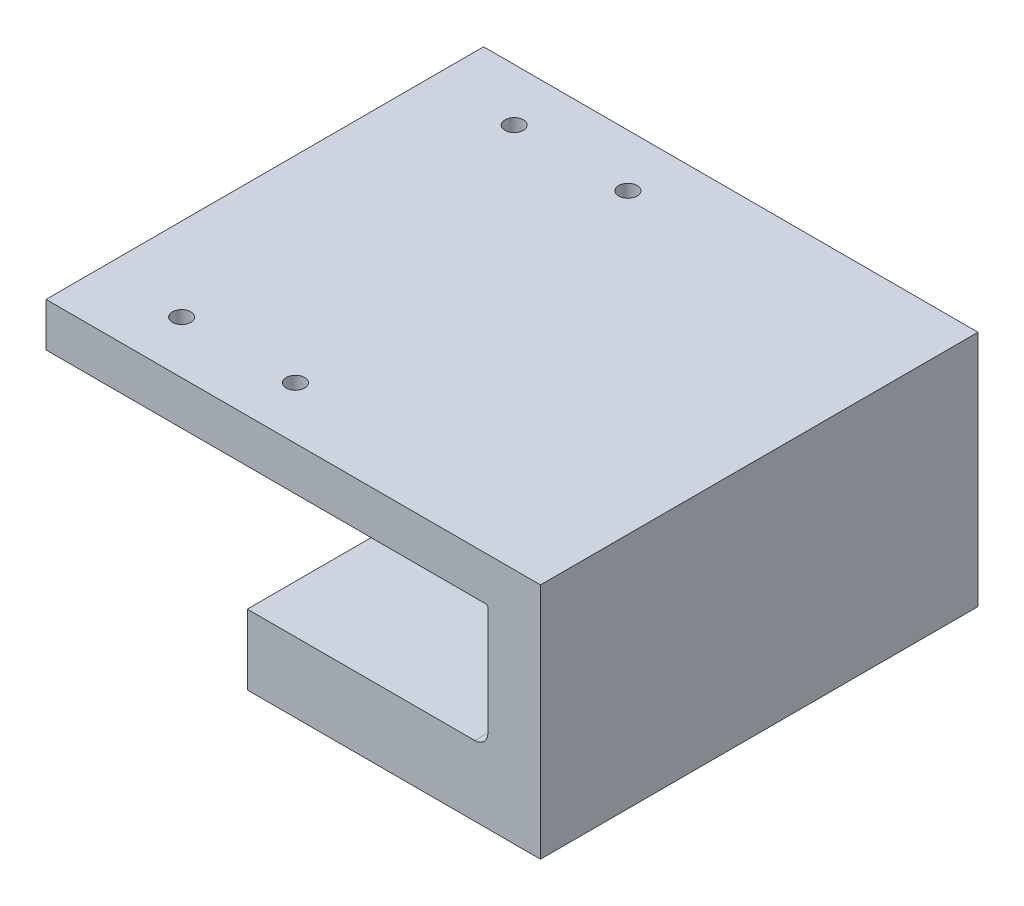
ISO-10303-21;
HEADER;
FILE_DESCRIPTION(('STEP AP214'),'2;1');
FILE_NAME('part.step','',(''),(''),'','','');
FILE_SCHEMA(('AUTOMOTIVE_DESIGN { 1 0 10303 214 1 1 1 1 }'));
ENDSEC;
DATA;
#1=APPLICATION_CONTEXT('core data for automotive mechanical design processes');
#2=APPLICATION_PROTOCOL_DEFINITION('international standard','automotive_design',2000,#1);
#3=PRODUCT_CONTEXT('',#1,'mechanical');
#4=PRODUCT('Part','Part','',(#3));
#5=PRODUCT_RELATED_PRODUCT_CATEGORY('part','',(#4));
#6=PRODUCT_DEFINITION_FORMATION('','',#4);
#7=PRODUCT_DEFINITION_CONTEXT('part definition',#1,'design');
#8=PRODUCT_DEFINITION('design','',#6,#7);
#9=PRODUCT_DEFINITION_SHAPE('','',#8);
#10=(LENGTH_UNIT() NAMED_UNIT(*) SI_UNIT(.MILLI.,.METRE.));
#11=(NAMED_UNIT(*) PLANE_ANGLE_UNIT() SI_UNIT($,.RADIAN.));
#12=(NAMED_UNIT(*) SI_UNIT($,.STERADIAN.) SOLID_ANGLE_UNIT());
#13=UNCERTAINTY_MEASURE_WITH_UNIT(LENGTH_MEASURE(1.E-05),#10,'distance_accuracy_value','');
#14=(GEOMETRIC_REPRESENTATION_CONTEXT(3) GLOBAL_UNCERTAINTY_ASSIGNED_CONTEXT((#13)) GLOBAL_UNIT_ASSIGNED_CONTEXT((#10,
#11,#12)) REPRESENTATION_CONTEXT('',''));
#15=CARTESIAN_POINT('',(0.,0.,0.));
#16=DIRECTION('',(0.,0.,1.));
#17=DIRECTION('',(1.,0.,0.));
#18=AXIS2_PLACEMENT_3D('',#15,#16,#17);
#19=CARTESIAN_POINT('',(113.,-44.3,100.));
#20=DIRECTION('',(0.,1.,0.));
#21=DIRECTION('',(-1.,0.,0.));
#22=AXIS2_PLACEMENT_3D('',#19,#20,#21);
#23=PLANE('',#22);
#24=DIRECTION('',(1.,0.,0.));
#25=VECTOR('',#24,1.);
#26=CARTESIAN_POINT('',(113.,-44.3,0.));
#27=LINE('',#26,#25);
#28=CARTESIAN_POINT('',(46.,-44.3,0.));
#29=VERTEX_POINT('',#28);
#30=CARTESIAN_POINT('',(113.,-44.3,0.));
#31=VERTEX_POINT('',#30);
#32=EDGE_CURVE('E356',#29,#31,#27,.T.);
#33=ORIENTED_EDGE('',*,*,#32,.T.);
#34=DIRECTION('',(0.,0.,-1.));
#35=VECTOR('',#34,1.);
#36=CARTESIAN_POINT('',(113.,-44.3,100.));
#37=LINE('',#36,#35);
#38=CARTESIAN_POINT('',(113.,-44.3,100.));
#39=VERTEX_POINT('',#38);
#40=EDGE_CURVE('E378',#39,#31,#37,.T.);
#41=ORIENTED_EDGE('',*,*,#40,.F.);
#42=DIRECTION('',(1.,0.,0.));
#43=VECTOR('',#42,1.);
#44=CARTESIAN_POINT('',(113.,-44.3,100.));
#45=LINE('',#44,#43);
#46=CARTESIAN_POINT('',(46.,-44.3,100.));
#47=VERTEX_POINT('',#46);
#48=EDGE_CURVE('E335',#47,#39,#45,.T.);
#49=ORIENTED_EDGE('',*,*,#48,.F.);
#50=DIRECTION('',(0.,0.,-1.));
#51=VECTOR('',#50,1.);
#52=CARTESIAN_POINT('',(46.,-44.3,100.));
#53=LINE('',#52,#51);
#54=EDGE_CURVE('E385',#47,#29,#53,.T.);
#55=ORIENTED_EDGE('',*,*,#54,.T.);
#56=EDGE_LOOP('',(#33,#41,#49,#55));
#57=FACE_BOUND('',#56,.T.);
#58=DIRECTION('',(-0.707106781186551,0.,0.707106781186544));
#59=VECTOR('',#58,1.);
#60=CARTESIAN_POINT('',(69.04,-44.3,53.04));
#61=LINE('',#60,#59);
#62=CARTESIAN_POINT('',(68.9816904810516,-44.3,53.0983095189484));
#63=VERTEX_POINT('',#62);
#64=CARTESIAN_POINT('',(66.,-44.3,56.08));
#65=VERTEX_POINT('',#64);
#66=EDGE_CURVE('E215',#63,#65,#61,.T.);
#67=ORIENTED_EDGE('',*,*,#66,.F.);
#68=CARTESIAN_POINT('',(66.,-44.3,50.));
#69=DIRECTION('',(0.,-1.,0.));
#70=DIRECTION('',(1.,0.,0.));
#71=AXIS2_PLACEMENT_3D('',#68,#69,#70);
#72=CIRCLE('',#71,4.3);
#73=CARTESIAN_POINT('',(63.0183095189485,-44.3,53.0983095189485));
#74=VERTEX_POINT('',#73);
#75=EDGE_CURVE('E314',#74,#63,#72,.T.);
#76=ORIENTED_EDGE('',*,*,#75,.F.);
#77=DIRECTION('',(-0.707106781186548,0.,-0.707106781186548));
#78=VECTOR('',#77,1.);
#79=CARTESIAN_POINT('',(66.,-44.3,56.08));
#80=LINE('',#79,#78);
#81=EDGE_CURVE('E207',#65,#74,#80,.T.);
#82=ORIENTED_EDGE('',*,*,#81,.F.);
#83=EDGE_LOOP('',(#67,#76,#82));
#84=FACE_BOUND('',#83,.T.);
#85=ADVANCED_FACE('F42',(#57,#84),#23,.F.);
#86=CARTESIAN_POINT('',(66.,-28.3,50.));
#87=DIRECTION('',(0.,-1.,0.));
#88=DIRECTION('',(1.,0.,0.));
#89=AXIS2_PLACEMENT_3D('',#86,#87,#88);
#90=CYLINDRICAL_SURFACE('',#89,4.3);
#91=CARTESIAN_POINT('',(66.,-32.15,50.));
#92=DIRECTION('',(0.,1.,0.));
#93=DIRECTION('',(0.,0.,1.));
#94=AXIS2_PLACEMENT_3D('',#91,#92,#93);
#95=CIRCLE('',#94,4.3);
#96=CARTESIAN_POINT('',(63.0183095189486,-32.15,53.0983095189486));
#97=VERTEX_POINT('',#96);
#98=CARTESIAN_POINT('',(68.9816904810516,-32.15,53.0983095189484));
#99=VERTEX_POINT('',#98);
#100=EDGE_CURVE('E318',#97,#99,#95,.F.);
#101=ORIENTED_EDGE('',*,*,#100,.T.);
#102=DIRECTION('',(0.,-1.,0.));
#103=VECTOR('',#102,1.);
#104=CARTESIAN_POINT('',(68.9816904810515,-28.3,53.0983095189485));
#105=LINE('',#104,#103);
#106=CARTESIAN_POINT('',(68.9816904810516,-28.3,53.0983095189484));
#107=VERTEX_POINT('',#106);
#108=EDGE_CURVE('E231',#99,#107,#105,.F.);
#109=ORIENTED_EDGE('',*,*,#108,.T.);
#110=CARTESIAN_POINT('',(66.,-28.3,50.));
#111=DIRECTION('',(0.,-1.,0.));
#112=DIRECTION('',(1.,0.,0.));
#113=AXIS2_PLACEMENT_3D('',#110,#111,#112);
#114=CIRCLE('',#113,4.3);
#115=CARTESIAN_POINT('',(63.0183095189484,-28.3,53.0983095189485));
#116=VERTEX_POINT('',#115);
#117=EDGE_CURVE('E210',#116,#107,#114,.T.);
#118=ORIENTED_EDGE('',*,*,#117,.F.);
#119=DIRECTION('',(0.,-1.,0.));
#120=VECTOR('',#119,1.);
#121=CARTESIAN_POINT('',(63.0183095189485,-28.3,53.0983095189485));
#122=LINE('',#121,#120);
#123=EDGE_CURVE('E200',#116,#97,#122,.T.);
#124=ORIENTED_EDGE('',*,*,#123,.T.);
#125=EDGE_LOOP('',(#101,#109,#118,#124));
#126=FACE_BOUND('',#125,.T.);
#127=ADVANCED_FACE('F451',(#126),#90,.F.);
#128=CARTESIAN_POINT('',(101.,0.,100.));
#129=DIRECTION('',(0.,1.,0.));
#130=DIRECTION('',(-1.,0.,0.));
#131=AXIS2_PLACEMENT_3D('',#128,#129,#130);
#132=PLANE('',#131);
#133=DIRECTION('',(1.,0.,0.));
#134=VECTOR('',#133,1.);
#135=CARTESIAN_POINT('',(101.,0.,0.));
#136=LINE('',#135,#134);
#137=CARTESIAN_POINT('',(0.,0.,0.));
#138=VERTEX_POINT('',#137);
#139=CARTESIAN_POINT('',(100.5,0.,0.));
#140=VERTEX_POINT('',#139);
#141=EDGE_CURVE('E311',#138,#140,#136,.T.);
#142=ORIENTED_EDGE('',*,*,#141,.T.);
#143=DIRECTION('',(0.,0.,-1.));
#144=VECTOR('',#143,1.);
#145=CARTESIAN_POINT('',(100.5,0.,100.));
#146=LINE('',#145,#144);
#147=CARTESIAN_POINT('',(100.5,0.,100.));
#148=VERTEX_POINT('',#147);
#149=EDGE_CURVE('E58',#140,#148,#146,.F.);
#150=ORIENTED_EDGE('',*,*,#149,.T.);
#151=DIRECTION('',(1.,0.,0.));
#152=VECTOR('',#151,1.);
#153=CARTESIAN_POINT('',(101.,0.,100.));
#154=LINE('',#153,#152);
#155=CARTESIAN_POINT('',(0.,0.,100.));
#156=VERTEX_POINT('',#155);
#157=EDGE_CURVE('E317',#156,#148,#154,.T.);
#158=ORIENTED_EDGE('',*,*,#157,.F.);
#159=DIRECTION('',(0.,0.,-1.));
#160=VECTOR('',#159,1.);
#161=CARTESIAN_POINT('',(0.,0.,100.));
#162=LINE('',#161,#160);
#163=EDGE_CURVE('E343',#156,#138,#162,.T.);
#164=ORIENTED_EDGE('',*,*,#163,.T.);
#165=EDGE_LOOP('',(#142,#150,#158,#164));
#166=FACE_BOUND('',#165,.T.);
#167=ADVANCED_FACE('F456',(#166),#132,.F.);
#168=CARTESIAN_POINT('',(101.,-28.3,100.));
#169=DIRECTION('',(1.,0.,0.));
#170=DIRECTION('',(0.,1.,0.));
#171=AXIS2_PLACEMENT_3D('',#168,#169,#170);
#172=PLANE('',#171);
#173=DIRECTION('',(0.,-1.,0.));
#174=VECTOR('',#173,1.);
#175=CARTESIAN_POINT('',(101.,-28.3,100.));
#176=LINE('',#175,#174);
#177=CARTESIAN_POINT('',(101.,-0.500000000000004,100.));
#178=VERTEX_POINT('',#177);
#179=CARTESIAN_POINT('',(101.,-25.3,100.));
#180=VERTEX_POINT('',#179);
#181=EDGE_CURVE('E325',#178,#180,#176,.T.);
#182=ORIENTED_EDGE('',*,*,#181,.F.);
#183=DIRECTION('',(0.,0.,-1.));
#184=VECTOR('',#183,1.);
#185=CARTESIAN_POINT('',(101.,-0.499999999999997,0.));
#186=LINE('',#185,#184);
#187=CARTESIAN_POINT('',(101.,-0.500000000000004,0.));
#188=VERTEX_POINT('',#187);
#189=EDGE_CURVE('E420',#178,#188,#186,.T.);
#190=ORIENTED_EDGE('',*,*,#189,.T.);
#191=DIRECTION('',(0.,-1.,0.));
#192=VECTOR('',#191,1.);
#193=CARTESIAN_POINT('',(101.,-28.3,0.));
#194=LINE('',#193,#192);
#195=CARTESIAN_POINT('',(101.,-25.3,0.));
#196=VERTEX_POINT('',#195);
#197=EDGE_CURVE('E350',#188,#196,#194,.T.);
#198=ORIENTED_EDGE('',*,*,#197,.T.);
#199=DIRECTION('',(0.,0.,-1.));
#200=VECTOR('',#199,1.);
#201=CARTESIAN_POINT('',(101.,-25.3,100.));
#202=LINE('',#201,#200);
#203=EDGE_CURVE('E409',#196,#180,#202,.F.);
#204=ORIENTED_EDGE('',*,*,#203,.T.);
#205=EDGE_LOOP('',(#182,#190,#198,#204));
#206=FACE_BOUND('',#205,.T.);
#207=ADVANCED_FACE('F473',(#206),#172,.F.);
#208=CARTESIAN_POINT('',(46.,-28.3,100.));
#209=DIRECTION('',(0.,-1.,0.));
#210=DIRECTION('',(0.,0.,-1.));
#211=AXIS2_PLACEMENT_3D('',#208,#209,#210);
#212=PLANE('',#211);
#213=ORIENTED_EDGE('',*,*,#117,.T.);
#214=DIRECTION('',(-0.707106781186551,0.,0.707106781186544));
#215=VECTOR('',#214,1.);
#216=CARTESIAN_POINT('',(69.04,-28.3,53.04));
#217=LINE('',#216,#215);
#218=CARTESIAN_POINT('',(66.,-28.3,56.08));
#219=VERTEX_POINT('',#218);
#220=EDGE_CURVE('E183',#107,#219,#217,.T.);
#221=ORIENTED_EDGE('',*,*,#220,.T.);
#222=DIRECTION('',(-0.707106781186548,0.,-0.707106781186548));
#223=VECTOR('',#222,1.);
#224=CARTESIAN_POINT('',(66.,-28.3,56.08));
#225=LINE('',#224,#223);
#226=EDGE_CURVE('E198',#219,#116,#225,.T.);
#227=ORIENTED_EDGE('',*,*,#226,.T.);
#228=EDGE_LOOP('',(#213,#221,#227));
#229=FACE_BOUND('',#228,.T.);
#230=DIRECTION('',(-1.,0.,0.));
#231=VECTOR('',#230,1.);
#232=CARTESIAN_POINT('',(46.,-28.3,100.));
#233=LINE('',#232,#231);
#234=CARTESIAN_POINT('',(98.,-28.3,100.));
#235=VERTEX_POINT('',#234);
#236=CARTESIAN_POINT('',(46.,-28.3,100.));
#237=VERTEX_POINT('',#236);
#238=EDGE_CURVE('E326',#235,#237,#233,.T.);
#239=ORIENTED_EDGE('',*,*,#238,.F.);
#240=DIRECTION('',(0.,0.,-1.));
#241=VECTOR('',#240,1.);
#242=CARTESIAN_POINT('',(98.,-28.3,0.));
#243=LINE('',#242,#241);
#244=CARTESIAN_POINT('',(98.,-28.3,0.));
#245=VERTEX_POINT('',#244);
#246=EDGE_CURVE('E404',#235,#245,#243,.T.);
#247=ORIENTED_EDGE('',*,*,#246,.T.);
#248=DIRECTION('',(-1.,0.,0.));
#249=VECTOR('',#248,1.);
#250=CARTESIAN_POINT('',(46.,-28.3,0.));
#251=LINE('',#250,#249);
#252=CARTESIAN_POINT('',(46.,-28.3,0.));
#253=VERTEX_POINT('',#252);
#254=EDGE_CURVE('E348',#245,#253,#251,.T.);
#255=ORIENTED_EDGE('',*,*,#254,.T.);
#256=DIRECTION('',(0.,0.,-1.));
#257=VECTOR('',#256,1.);
#258=CARTESIAN_POINT('',(46.,-28.3,100.));
#259=LINE('',#258,#257);
#260=EDGE_CURVE('E387',#237,#253,#259,.T.);
#261=ORIENTED_EDGE('',*,*,#260,.F.);
#262=EDGE_LOOP('',(#239,#247,#255,#261));
#263=FACE_BOUND('',#262,.T.);
#264=ADVANCED_FACE('F202',(#229,#263),#212,.F.);
#265=CARTESIAN_POINT('',(46.,-44.3,100.));
#266=DIRECTION('',(1.,0.,0.));
#267=DIRECTION('',(0.,0.,-1.));
#268=AXIS2_PLACEMENT_3D('',#265,#266,#267);
#269=PLANE('',#268);
#270=DIRECTION('',(0.,0.,1.));
#271=VECTOR('',#270,1.);
#272=CARTESIAN_POINT('',(46.,-40.45,43.35));
#273=LINE('',#272,#271);
#274=CARTESIAN_POINT('',(46.,-40.45,43.35));
#275=VERTEX_POINT('',#274);
#276=CARTESIAN_POINT('',(46.,-40.45,56.65));
#277=VERTEX_POINT('',#276);
#278=EDGE_CURVE('E287',#275,#277,#273,.T.);
#279=ORIENTED_EDGE('',*,*,#278,.F.);
#280=DIRECTION('',(0.,-1.,0.));
#281=VECTOR('',#280,1.);
#282=CARTESIAN_POINT('',(46.,-32.15,43.35));
#283=LINE('',#282,#281);
#284=CARTESIAN_POINT('',(46.,-32.15,43.35));
#285=VERTEX_POINT('',#284);
#286=EDGE_CURVE('E263',#285,#275,#283,.T.);
#287=ORIENTED_EDGE('',*,*,#286,.F.);
#288=DIRECTION('',(0.,0.,-1.));
#289=VECTOR('',#288,1.);
#290=CARTESIAN_POINT('',(46.,-32.15,43.35));
#291=LINE('',#290,#289);
#292=CARTESIAN_POINT('',(46.,-32.15,56.65));
#293=VERTEX_POINT('',#292);
#294=EDGE_CURVE('E275',#293,#285,#291,.T.);
#295=ORIENTED_EDGE('',*,*,#294,.F.);
#296=DIRECTION('',(0.,1.,0.));
#297=VECTOR('',#296,1.);
#298=CARTESIAN_POINT('',(46.,-32.15,56.65));
#299=LINE('',#298,#297);
#300=EDGE_CURVE('E292',#277,#293,#299,.T.);
#301=ORIENTED_EDGE('',*,*,#300,.F.);
#302=EDGE_LOOP('',(#279,#287,#295,#301));
#303=FACE_BOUND('',#302,.T.);
#304=DIRECTION('',(0.,-1.,0.));
#305=VECTOR('',#304,1.);
#306=CARTESIAN_POINT('',(46.,-44.3,0.));
#307=LINE('',#306,#305);
#308=EDGE_CURVE('E354',#253,#29,#307,.T.);
#309=ORIENTED_EDGE('',*,*,#308,.T.);
#310=ORIENTED_EDGE('',*,*,#54,.F.);
#311=DIRECTION('',(0.,-1.,0.));
#312=VECTOR('',#311,1.);
#313=CARTESIAN_POINT('',(46.,-44.3,100.));
#314=LINE('',#313,#312);
#315=EDGE_CURVE('E328',#237,#47,#314,.T.);
#316=ORIENTED_EDGE('',*,*,#315,.F.);
#317=ORIENTED_EDGE('',*,*,#260,.T.);
#318=EDGE_LOOP('',(#309,#310,#316,#317));
#319=FACE_BOUND('',#318,.T.);
#320=ADVANCED_FACE('F465',(#303,#319),#269,.F.);
#321=CARTESIAN_POINT('',(113.,10.,100.));
#322=DIRECTION('',(-1.,0.,0.));
#323=DIRECTION('',(0.,0.,1.));
#324=AXIS2_PLACEMENT_3D('',#321,#322,#323);
#325=PLANE('',#324);
#326=DIRECTION('',(0.,1.,0.));
#327=VECTOR('',#326,1.);
#328=CARTESIAN_POINT('',(113.,10.,0.));
#329=LINE('',#328,#327);
#330=CARTESIAN_POINT('',(113.,10.,0.));
#331=VERTEX_POINT('',#330);
#332=EDGE_CURVE('E358',#31,#331,#329,.T.);
#333=ORIENTED_EDGE('',*,*,#332,.T.);
#334=DIRECTION('',(0.,0.,-1.));
#335=VECTOR('',#334,1.);
#336=CARTESIAN_POINT('',(113.,10.,100.));
#337=LINE('',#336,#335);
#338=CARTESIAN_POINT('',(113.,10.,100.));
#339=VERTEX_POINT('',#338);
#340=EDGE_CURVE('E372',#339,#331,#337,.T.);
#341=ORIENTED_EDGE('',*,*,#340,.F.);
#342=DIRECTION('',(0.,1.,0.));
#343=VECTOR('',#342,1.);
#344=CARTESIAN_POINT('',(113.,10.,100.));
#345=LINE('',#344,#343);
#346=EDGE_CURVE('E333',#39,#339,#345,.T.);
#347=ORIENTED_EDGE('',*,*,#346,.F.);
#348=ORIENTED_EDGE('',*,*,#40,.T.);
#349=EDGE_LOOP('',(#333,#341,#347,#348));
#350=FACE_BOUND('',#349,.T.);
#351=ADVANCED_FACE('F464',(#350),#325,.F.);
#352=CARTESIAN_POINT('',(0.,10.,100.));
#353=DIRECTION('',(0.,-1.,0.));
#354=DIRECTION('',(0.,0.,-1.));
#355=AXIS2_PLACEMENT_3D('',#352,#353,#354);
#356=PLANE('',#355);
#357=CARTESIAN_POINT('',(19.,10.,88.));
#358=DIRECTION('',(0.,1.,0.));
#359=DIRECTION('',(0.,0.,1.));
#360=AXIS2_PLACEMENT_3D('',#357,#358,#359);
#361=CIRCLE('',#360,2.1);
#362=CARTESIAN_POINT('',(19.,10.,90.1));
#363=VERTEX_POINT('',#362);
#364=EDGE_CURVE('E244',#363,#363,#361,.T.);
#365=ORIENTED_EDGE('',*,*,#364,.F.);
#366=EDGE_LOOP('',(#365));
#367=FACE_BOUND('',#366,.T.);
#368=CARTESIAN_POINT('',(45.,10.,12.));
#369=DIRECTION('',(0.,1.,0.));
#370=DIRECTION('',(0.,0.,1.));
#371=AXIS2_PLACEMENT_3D('',#368,#369,#370);
#372=CIRCLE('',#371,2.1);
#373=CARTESIAN_POINT('',(45.,10.,14.1));
#374=VERTEX_POINT('',#373);
#375=EDGE_CURVE('E252',#374,#374,#372,.T.);
#376=ORIENTED_EDGE('',*,*,#375,.F.);
#377=EDGE_LOOP('',(#376));
#378=FACE_BOUND('',#377,.T.);
#379=CARTESIAN_POINT('',(45.,10.,88.));
#380=DIRECTION('',(0.,1.,0.));
#381=DIRECTION('',(0.,0.,1.));
#382=AXIS2_PLACEMENT_3D('',#379,#380,#381);
#383=CIRCLE('',#382,2.1);
#384=CARTESIAN_POINT('',(45.,10.,90.1));
#385=VERTEX_POINT('',#384);
#386=EDGE_CURVE('E235',#385,#385,#383,.T.);
#387=ORIENTED_EDGE('',*,*,#386,.F.);
#388=EDGE_LOOP('',(#387));
#389=FACE_BOUND('',#388,.T.);
#390=CARTESIAN_POINT('',(19.,10.,12.));
#391=DIRECTION('',(0.,1.,0.));
#392=DIRECTION('',(0.,0.,1.));
#393=AXIS2_PLACEMENT_3D('',#390,#391,#392);
#394=CIRCLE('',#393,2.1);
#395=CARTESIAN_POINT('',(19.,10.,14.1));
#396=VERTEX_POINT('',#395);
#397=EDGE_CURVE('E247',#396,#396,#394,.T.);
#398=ORIENTED_EDGE('',*,*,#397,.F.);
#399=EDGE_LOOP('',(#398));
#400=FACE_BOUND('',#399,.T.);
#401=DIRECTION('',(-1.,0.,0.));
#402=VECTOR('',#401,1.);
#403=CARTESIAN_POINT('',(0.,10.,0.));
#404=LINE('',#403,#402);
#405=CARTESIAN_POINT('',(0.,10.,0.));
#406=VERTEX_POINT('',#405);
#407=EDGE_CURVE('E362',#331,#406,#404,.T.);
#408=ORIENTED_EDGE('',*,*,#407,.T.);
#409=DIRECTION('',(0.,0.,-1.));
#410=VECTOR('',#409,1.);
#411=CARTESIAN_POINT('',(0.,10.,100.));
#412=LINE('',#411,#410);
#413=CARTESIAN_POINT('',(0.,10.,100.));
#414=VERTEX_POINT('',#413);
#415=EDGE_CURVE('E367',#414,#406,#412,.T.);
#416=ORIENTED_EDGE('',*,*,#415,.F.);
#417=DIRECTION('',(-1.,0.,0.));
#418=VECTOR('',#417,1.);
#419=CARTESIAN_POINT('',(0.,10.,100.));
#420=LINE('',#419,#418);
#421=EDGE_CURVE('E339',#339,#414,#420,.T.);
#422=ORIENTED_EDGE('',*,*,#421,.F.);
#423=ORIENTED_EDGE('',*,*,#340,.T.);
#424=EDGE_LOOP('',(#408,#416,#422,#423));
#425=FACE_BOUND('',#424,.T.);
#426=ADVANCED_FACE('F509',(#367,#378,#389,#400,#425),#356,.F.);
#427=CARTESIAN_POINT('',(0.,0.,100.));
#428=DIRECTION('',(1.,0.,0.));
#429=DIRECTION('',(0.,0.,-1.));
#430=AXIS2_PLACEMENT_3D('',#427,#428,#429);
#431=PLANE('',#430);
#432=DIRECTION('',(0.,-1.,0.));
#433=VECTOR('',#432,1.);
#434=CARTESIAN_POINT('',(0.,0.,0.));
#435=LINE('',#434,#433);
#436=EDGE_CURVE('E323',#406,#138,#435,.T.);
#437=ORIENTED_EDGE('',*,*,#436,.T.);
#438=ORIENTED_EDGE('',*,*,#163,.F.);
#439=DIRECTION('',(0.,-1.,0.));
#440=VECTOR('',#439,1.);
#441=CARTESIAN_POINT('',(0.,0.,100.));
#442=LINE('',#441,#440);
#443=EDGE_CURVE('E341',#414,#156,#442,.T.);
#444=ORIENTED_EDGE('',*,*,#443,.F.);
#445=ORIENTED_EDGE('',*,*,#415,.T.);
#446=EDGE_LOOP('',(#437,#438,#444,#445));
#447=FACE_BOUND('',#446,.T.);
#448=ADVANCED_FACE('F511',(#447),#431,.F.);
#449=CARTESIAN_POINT('',(0.,0.,100.));
#450=DIRECTION('',(0.,0.,-1.));
#451=DIRECTION('',(-1.,0.,0.));
#452=AXIS2_PLACEMENT_3D('',#449,#450,#451);
#453=PLANE('',#452);
#454=ORIENTED_EDGE('',*,*,#157,.T.);
#455=CARTESIAN_POINT('',(100.5,-0.499999999999997,100.));
#456=DIRECTION('',(0.,0.,-1.));
#457=DIRECTION('',(-1.,0.,0.));
#458=AXIS2_PLACEMENT_3D('',#455,#456,#457);
#459=CIRCLE('',#458,0.5);
#460=EDGE_CURVE('E11',#148,#178,#459,.T.);
#461=ORIENTED_EDGE('',*,*,#460,.T.);
#462=ORIENTED_EDGE('',*,*,#181,.T.);
#463=CARTESIAN_POINT('',(98.,-25.3,100.));
#464=DIRECTION('',(0.,0.,-1.));
#465=DIRECTION('',(-1.,0.,0.));
#466=AXIS2_PLACEMENT_3D('',#463,#464,#465);
#467=CIRCLE('',#466,3.);
#468=EDGE_CURVE('E418',#180,#235,#467,.T.);
#469=ORIENTED_EDGE('',*,*,#468,.T.);
#470=ORIENTED_EDGE('',*,*,#238,.T.);
#471=ORIENTED_EDGE('',*,*,#315,.T.);
#472=ORIENTED_EDGE('',*,*,#48,.T.);
#473=ORIENTED_EDGE('',*,*,#346,.T.);
#474=ORIENTED_EDGE('',*,*,#421,.T.);
#475=ORIENTED_EDGE('',*,*,#443,.T.);
#476=EDGE_LOOP('',(#454,#461,#462,#469,#470,#471,#472,#473,#474,#475));
#477=FACE_BOUND('',#476,.T.);
#478=ADVANCED_FACE('F487',(#477),#453,.F.);
#479=CARTESIAN_POINT('',(0.,0.,0.));
#480=DIRECTION('',(0.,0.,-1.));
#481=DIRECTION('',(-1.,0.,0.));
#482=AXIS2_PLACEMENT_3D('',#479,#480,#481);
#483=PLANE('',#482);
#484=ORIENTED_EDGE('',*,*,#141,.F.);
#485=ORIENTED_EDGE('',*,*,#436,.F.);
#486=ORIENTED_EDGE('',*,*,#407,.F.);
#487=ORIENTED_EDGE('',*,*,#332,.F.);
#488=ORIENTED_EDGE('',*,*,#32,.F.);
#489=ORIENTED_EDGE('',*,*,#308,.F.);
#490=ORIENTED_EDGE('',*,*,#254,.F.);
#491=CARTESIAN_POINT('',(98.,-25.3,0.));
#492=DIRECTION('',(0.,0.,-1.));
#493=DIRECTION('',(-1.,0.,0.));
#494=AXIS2_PLACEMENT_3D('',#491,#492,#493);
#495=CIRCLE('',#494,3.);
#496=EDGE_CURVE('E412',#245,#196,#495,.F.);
#497=ORIENTED_EDGE('',*,*,#496,.T.);
#498=ORIENTED_EDGE('',*,*,#197,.F.);
#499=CARTESIAN_POINT('',(100.5,-0.499999999999997,0.));
#500=DIRECTION('',(0.,0.,-1.));
#501=DIRECTION('',(-1.,0.,0.));
#502=AXIS2_PLACEMENT_3D('',#499,#500,#501);
#503=CIRCLE('',#502,0.5);
#504=EDGE_CURVE('E52',#188,#140,#503,.F.);
#505=ORIENTED_EDGE('',*,*,#504,.T.);
#506=EDGE_LOOP('',(#484,#485,#486,#487,#488,#489,#490,#497,#498,#505));
#507=FACE_BOUND('',#506,.T.);
#508=ADVANCED_FACE('F516',(#507),#483,.T.);
#509=ORIENTED_EDGE('',*,*,#75,.T.);
#510=DIRECTION('',(0.,-1.,0.));
#511=VECTOR('',#510,1.);
#512=CARTESIAN_POINT('',(68.9816904810515,-28.3,53.0983095189485));
#513=LINE('',#512,#511);
#514=CARTESIAN_POINT('',(68.9816904810516,-40.45,53.0983095189484));
#515=VERTEX_POINT('',#514);
#516=EDGE_CURVE('E223',#63,#515,#513,.F.);
#517=ORIENTED_EDGE('',*,*,#516,.T.);
#518=CARTESIAN_POINT('',(66.,-40.45,50.));
#519=DIRECTION('',(0.,-1.,0.));
#520=DIRECTION('',(0.,0.,-1.));
#521=AXIS2_PLACEMENT_3D('',#518,#519,#520);
#522=CIRCLE('',#521,4.3);
#523=CARTESIAN_POINT('',(63.0183095189486,-40.45,53.0983095189486));
#524=VERTEX_POINT('',#523);
#525=EDGE_CURVE('E301',#515,#524,#522,.F.);
#526=ORIENTED_EDGE('',*,*,#525,.T.);
#527=DIRECTION('',(0.,-1.,0.));
#528=VECTOR('',#527,1.);
#529=CARTESIAN_POINT('',(63.0183095189485,-28.3,53.0983095189485));
#530=LINE('',#529,#528);
#531=EDGE_CURVE('E192',#524,#74,#530,.T.);
#532=ORIENTED_EDGE('',*,*,#531,.T.);
#533=EDGE_LOOP('',(#509,#517,#526,#532));
#534=FACE_BOUND('',#533,.T.);
#535=ADVANCED_FACE('F436',(#534),#90,.F.);
#536=CARTESIAN_POINT('',(73.,-32.15,43.35));
#537=DIRECTION('',(0.,1.,0.));
#538=DIRECTION('',(0.,0.,1.));
#539=AXIS2_PLACEMENT_3D('',#536,#537,#538);
#540=PLANE('',#539);
#541=ORIENTED_EDGE('',*,*,#294,.T.);
#542=DIRECTION('',(-1.,0.,0.));
#543=VECTOR('',#542,1.);
#544=CARTESIAN_POINT('',(73.,-32.15,43.35));
#545=LINE('',#544,#543);
#546=CARTESIAN_POINT('',(73.,-32.15,43.35));
#547=VERTEX_POINT('',#546);
#548=EDGE_CURVE('E299',#547,#285,#545,.T.);
#549=ORIENTED_EDGE('',*,*,#548,.F.);
#550=DIRECTION('',(0.,0.,-1.));
#551=VECTOR('',#550,1.);
#552=CARTESIAN_POINT('',(73.,-32.15,43.35));
#553=LINE('',#552,#551);
#554=CARTESIAN_POINT('',(73.,-32.15,56.65));
#555=VERTEX_POINT('',#554);
#556=EDGE_CURVE('E278',#555,#547,#553,.T.);
#557=ORIENTED_EDGE('',*,*,#556,.F.);
#558=DIRECTION('',(-1.,0.,0.));
#559=VECTOR('',#558,1.);
#560=CARTESIAN_POINT('',(73.,-32.15,56.65));
#561=LINE('',#560,#559);
#562=EDGE_CURVE('E302',#555,#293,#561,.T.);
#563=ORIENTED_EDGE('',*,*,#562,.T.);
#564=EDGE_LOOP('',(#541,#549,#557,#563));
#565=FACE_BOUND('',#564,.T.);
#566=DIRECTION('',(0.707106781186548,0.,0.707106781186548));
#567=VECTOR('',#566,1.);
#568=CARTESIAN_POINT('',(63.135,-32.15,53.215));
#569=LINE('',#568,#567);
#570=CARTESIAN_POINT('',(66.,-32.15,56.08));
#571=VERTEX_POINT('',#570);
#572=EDGE_CURVE('E219',#97,#571,#569,.T.);
#573=ORIENTED_EDGE('',*,*,#572,.T.);
#574=DIRECTION('',(0.707106781186551,0.,-0.707106781186544));
#575=VECTOR('',#574,1.);
#576=CARTESIAN_POINT('',(75.865,-32.15,46.215));
#577=LINE('',#576,#575);
#578=EDGE_CURVE('E189',#571,#99,#577,.T.);
#579=ORIENTED_EDGE('',*,*,#578,.T.);
#580=ORIENTED_EDGE('',*,*,#100,.F.);
#581=EDGE_LOOP('',(#573,#579,#580));
#582=FACE_BOUND('',#581,.T.);
#583=ADVANCED_FACE('F524',(#565,#582),#540,.F.);
#584=CARTESIAN_POINT('',(73.,-40.45,43.35));
#585=DIRECTION('',(0.,-1.,0.));
#586=DIRECTION('',(0.,0.,-1.));
#587=AXIS2_PLACEMENT_3D('',#584,#585,#586);
#588=PLANE('',#587);
#589=ORIENTED_EDGE('',*,*,#278,.T.);
#590=DIRECTION('',(-1.,0.,0.));
#591=VECTOR('',#590,1.);
#592=CARTESIAN_POINT('',(73.,-40.45,56.65));
#593=LINE('',#592,#591);
#594=CARTESIAN_POINT('',(73.,-40.45,56.65));
#595=VERTEX_POINT('',#594);
#596=EDGE_CURVE('E305',#595,#277,#593,.T.);
#597=ORIENTED_EDGE('',*,*,#596,.F.);
#598=DIRECTION('',(0.,0.,1.));
#599=VECTOR('',#598,1.);
#600=CARTESIAN_POINT('',(73.,-40.45,43.35));
#601=LINE('',#600,#599);
#602=CARTESIAN_POINT('',(73.,-40.45,43.35));
#603=VERTEX_POINT('',#602);
#604=EDGE_CURVE('E271',#603,#595,#601,.T.);
#605=ORIENTED_EDGE('',*,*,#604,.F.);
#606=DIRECTION('',(-1.,0.,0.));
#607=VECTOR('',#606,1.);
#608=CARTESIAN_POINT('',(73.,-40.45,43.35));
#609=LINE('',#608,#607);
#610=EDGE_CURVE('E283',#603,#275,#609,.T.);
#611=ORIENTED_EDGE('',*,*,#610,.T.);
#612=EDGE_LOOP('',(#589,#597,#605,#611));
#613=FACE_BOUND('',#612,.T.);
#614=ORIENTED_EDGE('',*,*,#525,.F.);
#615=DIRECTION('',(-0.707106781186551,0.,0.707106781186544));
#616=VECTOR('',#615,1.);
#617=CARTESIAN_POINT('',(75.865,-40.45,46.215));
#618=LINE('',#617,#616);
#619=CARTESIAN_POINT('',(66.,-40.45,56.08));
#620=VERTEX_POINT('',#619);
#621=EDGE_CURVE('E400',#515,#620,#618,.T.);
#622=ORIENTED_EDGE('',*,*,#621,.T.);
#623=DIRECTION('',(-0.707106781186548,0.,-0.707106781186548));
#624=VECTOR('',#623,1.);
#625=CARTESIAN_POINT('',(63.135,-40.45,53.215));
#626=LINE('',#625,#624);
#627=EDGE_CURVE('E388',#620,#524,#626,.T.);
#628=ORIENTED_EDGE('',*,*,#627,.T.);
#629=EDGE_LOOP('',(#614,#622,#628));
#630=FACE_BOUND('',#629,.T.);
#631=ADVANCED_FACE('F438',(#613,#630),#588,.F.);
#632=CARTESIAN_POINT('',(73.,-32.15,43.35));
#633=DIRECTION('',(0.,0.,-1.));
#634=DIRECTION('',(-1.,0.,0.));
#635=AXIS2_PLACEMENT_3D('',#632,#633,#634);
#636=PLANE('',#635);
#637=ORIENTED_EDGE('',*,*,#286,.T.);
#638=ORIENTED_EDGE('',*,*,#610,.F.);
#639=DIRECTION('',(0.,-1.,0.));
#640=VECTOR('',#639,1.);
#641=CARTESIAN_POINT('',(73.,-32.15,43.35));
#642=LINE('',#641,#640);
#643=EDGE_CURVE('E270',#547,#603,#642,.T.);
#644=ORIENTED_EDGE('',*,*,#643,.F.);
#645=ORIENTED_EDGE('',*,*,#548,.T.);
#646=EDGE_LOOP('',(#637,#638,#644,#645));
#647=FACE_BOUND('',#646,.T.);
#648=ADVANCED_FACE('F563',(#647),#636,.F.);
#649=CARTESIAN_POINT('',(73.,-32.15,56.65));
#650=DIRECTION('',(0.,0.,1.));
#651=DIRECTION('',(1.,0.,0.));
#652=AXIS2_PLACEMENT_3D('',#649,#650,#651);
#653=PLANE('',#652);
#654=ORIENTED_EDGE('',*,*,#300,.T.);
#655=ORIENTED_EDGE('',*,*,#562,.F.);
#656=DIRECTION('',(0.,1.,0.));
#657=VECTOR('',#656,1.);
#658=CARTESIAN_POINT('',(73.,-32.15,56.65));
#659=LINE('',#658,#657);
#660=EDGE_CURVE('E277',#595,#555,#659,.T.);
#661=ORIENTED_EDGE('',*,*,#660,.F.);
#662=ORIENTED_EDGE('',*,*,#596,.T.);
#663=EDGE_LOOP('',(#654,#655,#661,#662));
#664=FACE_BOUND('',#663,.T.);
#665=ADVANCED_FACE('F554',(#664),#653,.F.);
#666=CARTESIAN_POINT('',(73.,0.,0.));
#667=DIRECTION('',(-1.,0.,0.));
#668=DIRECTION('',(0.,0.,1.));
#669=AXIS2_PLACEMENT_3D('',#666,#667,#668);
#670=PLANE('',#669);
#671=ORIENTED_EDGE('',*,*,#643,.T.);
#672=ORIENTED_EDGE('',*,*,#604,.T.);
#673=ORIENTED_EDGE('',*,*,#660,.T.);
#674=ORIENTED_EDGE('',*,*,#556,.T.);
#675=EDGE_LOOP('',(#671,#672,#673,#674));
#676=FACE_BOUND('',#675,.T.);
#677=ADVANCED_FACE('F542',(#676),#670,.T.);
#678=CARTESIAN_POINT('',(19.,2.,12.));
#679=DIRECTION('',(0.,1.,0.));
#680=DIRECTION('',(0.,0.,1.));
#681=AXIS2_PLACEMENT_3D('',#678,#679,#680);
#682=CYLINDRICAL_SURFACE('',#681,2.1);
#683=CARTESIAN_POINT('',(19.,2.,12.));
#684=DIRECTION('',(0.,1.,0.));
#685=DIRECTION('',(0.,0.,1.));
#686=AXIS2_PLACEMENT_3D('',#683,#684,#685);
#687=CIRCLE('',#686,2.1);
#688=CARTESIAN_POINT('',(19.,2.,14.1));
#689=VERTEX_POINT('',#688);
#690=EDGE_CURVE('E259',#689,#689,#687,.T.);
#691=ORIENTED_EDGE('',*,*,#690,.F.);
#692=EDGE_LOOP('',(#691));
#693=FACE_BOUND('',#692,.T.);
#694=ORIENTED_EDGE('',*,*,#397,.T.);
#695=EDGE_LOOP('',(#694));
#696=FACE_BOUND('',#695,.T.);
#697=ADVANCED_FACE('F545',(#693,#696),#682,.F.);
#698=CARTESIAN_POINT('',(19.,2.,12.));
#699=DIRECTION('',(0.,1.,0.));
#700=DIRECTION('',(0.,0.,1.));
#701=AXIS2_PLACEMENT_3D('',#698,#699,#700);
#702=PLANE('',#701);
#703=ORIENTED_EDGE('',*,*,#690,.T.);
#704=EDGE_LOOP('',(#703));
#705=FACE_BOUND('',#704,.T.);
#706=ADVANCED_FACE('F543',(#705),#702,.T.);
#707=CARTESIAN_POINT('',(45.,2.,88.));
#708=DIRECTION('',(0.,1.,0.));
#709=DIRECTION('',(0.,0.,1.));
#710=AXIS2_PLACEMENT_3D('',#707,#708,#709);
#711=CYLINDRICAL_SURFACE('',#710,2.1);
#712=CARTESIAN_POINT('',(45.,2.,88.));
#713=DIRECTION('',(0.,1.,0.));
#714=DIRECTION('',(0.,0.,1.));
#715=AXIS2_PLACEMENT_3D('',#712,#713,#714);
#716=CIRCLE('',#715,2.1);
#717=CARTESIAN_POINT('',(45.,2.,90.1));
#718=VERTEX_POINT('',#717);
#719=EDGE_CURVE('E233',#718,#718,#716,.T.);
#720=ORIENTED_EDGE('',*,*,#719,.F.);
#721=EDGE_LOOP('',(#720));
#722=FACE_BOUND('',#721,.T.);
#723=ORIENTED_EDGE('',*,*,#386,.T.);
#724=EDGE_LOOP('',(#723));
#725=FACE_BOUND('',#724,.T.);
#726=ADVANCED_FACE('F549',(#722,#725),#711,.F.);
#727=CARTESIAN_POINT('',(45.,2.,88.));
#728=DIRECTION('',(0.,1.,0.));
#729=DIRECTION('',(0.,0.,1.));
#730=AXIS2_PLACEMENT_3D('',#727,#728,#729);
#731=PLANE('',#730);
#732=ORIENTED_EDGE('',*,*,#719,.T.);
#733=EDGE_LOOP('',(#732));
#734=FACE_BOUND('',#733,.T.);
#735=ADVANCED_FACE('F616',(#734),#731,.T.);
#736=CARTESIAN_POINT('',(45.,2.,12.));
#737=DIRECTION('',(0.,1.,0.));
#738=DIRECTION('',(0.,0.,1.));
#739=AXIS2_PLACEMENT_3D('',#736,#737,#738);
#740=CYLINDRICAL_SURFACE('',#739,2.1);
#741=CARTESIAN_POINT('',(45.,2.,12.));
#742=DIRECTION('',(0.,1.,0.));
#743=DIRECTION('',(0.,0.,1.));
#744=AXIS2_PLACEMENT_3D('',#741,#742,#743);
#745=CIRCLE('',#744,2.1);
#746=CARTESIAN_POINT('',(45.,2.,14.1));
#747=VERTEX_POINT('',#746);
#748=EDGE_CURVE('E239',#747,#747,#745,.T.);
#749=ORIENTED_EDGE('',*,*,#748,.F.);
#750=EDGE_LOOP('',(#749));
#751=FACE_BOUND('',#750,.T.);
#752=ORIENTED_EDGE('',*,*,#375,.T.);
#753=EDGE_LOOP('',(#752));
#754=FACE_BOUND('',#753,.T.);
#755=ADVANCED_FACE('F623',(#751,#754),#740,.F.);
#756=CARTESIAN_POINT('',(45.,2.,12.));
#757=DIRECTION('',(0.,1.,0.));
#758=DIRECTION('',(0.,0.,1.));
#759=AXIS2_PLACEMENT_3D('',#756,#757,#758);
#760=PLANE('',#759);
#761=ORIENTED_EDGE('',*,*,#748,.T.);
#762=EDGE_LOOP('',(#761));
#763=FACE_BOUND('',#762,.T.);
#764=ADVANCED_FACE('F635',(#763),#760,.T.);
#765=CARTESIAN_POINT('',(19.,2.,88.));
#766=DIRECTION('',(0.,1.,0.));
#767=DIRECTION('',(0.,0.,1.));
#768=AXIS2_PLACEMENT_3D('',#765,#766,#767);
#769=CYLINDRICAL_SURFACE('',#768,2.1);
#770=CARTESIAN_POINT('',(19.,2.,88.));
#771=DIRECTION('',(0.,1.,0.));
#772=DIRECTION('',(0.,0.,1.));
#773=AXIS2_PLACEMENT_3D('',#770,#771,#772);
#774=CIRCLE('',#773,2.1);
#775=CARTESIAN_POINT('',(19.,2.,90.1));
#776=VERTEX_POINT('',#775);
#777=EDGE_CURVE('E249',#776,#776,#774,.T.);
#778=ORIENTED_EDGE('',*,*,#777,.F.);
#779=EDGE_LOOP('',(#778));
#780=FACE_BOUND('',#779,.T.);
#781=ORIENTED_EDGE('',*,*,#364,.T.);
#782=EDGE_LOOP('',(#781));
#783=FACE_BOUND('',#782,.T.);
#784=ADVANCED_FACE('F642',(#780,#783),#769,.F.);
#785=CARTESIAN_POINT('',(19.,2.,88.));
#786=DIRECTION('',(0.,1.,0.));
#787=DIRECTION('',(0.,0.,1.));
#788=AXIS2_PLACEMENT_3D('',#785,#786,#787);
#789=PLANE('',#788);
#790=ORIENTED_EDGE('',*,*,#777,.T.);
#791=EDGE_LOOP('',(#790));
#792=FACE_BOUND('',#791,.T.);
#793=ADVANCED_FACE('F447',(#792),#789,.T.);
#794=CARTESIAN_POINT('',(66.,-28.3,56.08));
#795=DIRECTION('',(-0.707106781186547,0.,0.707106781186547));
#796=DIRECTION('',(0.707106781186548,0.,0.707106781186548));
#797=AXIS2_PLACEMENT_3D('',#794,#795,#796);
#798=PLANE('',#797);
#799=ORIENTED_EDGE('',*,*,#627,.F.);
#800=DIRECTION('',(0.,-1.,0.));
#801=VECTOR('',#800,1.);
#802=CARTESIAN_POINT('',(66.,-28.3,56.08));
#803=LINE('',#802,#801);
#804=EDGE_CURVE('E194',#620,#65,#803,.T.);
#805=ORIENTED_EDGE('',*,*,#804,.T.);
#806=ORIENTED_EDGE('',*,*,#81,.T.);
#807=ORIENTED_EDGE('',*,*,#531,.F.);
#808=EDGE_LOOP('',(#799,#805,#806,#807));
#809=FACE_BOUND('',#808,.T.);
#810=ADVANCED_FACE('F429',(#809),#798,.F.);
#811=CARTESIAN_POINT('',(69.04,-28.3,53.04));
#812=DIRECTION('',(0.707106781186544,0.,0.707106781186551));
#813=DIRECTION('',(0.707106781186551,0.,-0.707106781186544));
#814=AXIS2_PLACEMENT_3D('',#811,#812,#813);
#815=PLANE('',#814);
#816=ORIENTED_EDGE('',*,*,#66,.T.);
#817=ORIENTED_EDGE('',*,*,#804,.F.);
#818=ORIENTED_EDGE('',*,*,#621,.F.);
#819=ORIENTED_EDGE('',*,*,#516,.F.);
#820=EDGE_LOOP('',(#816,#817,#818,#819));
#821=FACE_BOUND('',#820,.T.);
#822=ADVANCED_FACE('F439',(#821),#815,.F.);
#823=ORIENTED_EDGE('',*,*,#578,.F.);
#824=EDGE_CURVE('E182',#219,#571,#803,.T.);
#825=ORIENTED_EDGE('',*,*,#824,.F.);
#826=ORIENTED_EDGE('',*,*,#220,.F.);
#827=ORIENTED_EDGE('',*,*,#108,.F.);
#828=EDGE_LOOP('',(#823,#825,#826,#827));
#829=FACE_BOUND('',#828,.T.);
#830=ADVANCED_FACE('F181',(#829),#815,.F.);
#831=ORIENTED_EDGE('',*,*,#226,.F.);
#832=ORIENTED_EDGE('',*,*,#824,.T.);
#833=ORIENTED_EDGE('',*,*,#572,.F.);
#834=ORIENTED_EDGE('',*,*,#123,.F.);
#835=EDGE_LOOP('',(#831,#832,#833,#834));
#836=FACE_BOUND('',#835,.T.);
#837=ADVANCED_FACE('F197',(#836),#798,.F.);
#838=CARTESIAN_POINT('',(98.,-25.3,100.));
#839=DIRECTION('',(0.,0.,1.));
#840=DIRECTION('',(1.,0.,0.));
#841=AXIS2_PLACEMENT_3D('',#838,#839,#840);
#842=CYLINDRICAL_SURFACE('',#841,3.);
#843=ORIENTED_EDGE('',*,*,#468,.F.);
#844=ORIENTED_EDGE('',*,*,#203,.F.);
#845=ORIENTED_EDGE('',*,*,#496,.F.);
#846=ORIENTED_EDGE('',*,*,#246,.F.);
#847=EDGE_LOOP('',(#843,#844,#845,#846));
#848=FACE_BOUND('',#847,.T.);
#849=ADVANCED_FACE('F478',(#848),#842,.F.);
#850=CARTESIAN_POINT('',(100.5,-0.499999999999997,100.));
#851=DIRECTION('',(0.,0.,1.));
#852=DIRECTION('',(1.,0.,0.));
#853=AXIS2_PLACEMENT_3D('',#850,#851,#852);
#854=CYLINDRICAL_SURFACE('',#853,0.5);
#855=ORIENTED_EDGE('',*,*,#460,.F.);
#856=ORIENTED_EDGE('',*,*,#149,.F.);
#857=ORIENTED_EDGE('',*,*,#504,.F.);
#858=ORIENTED_EDGE('',*,*,#189,.F.);
#859=EDGE_LOOP('',(#855,#856,#857,#858));
#860=FACE_BOUND('',#859,.T.);
#861=ADVANCED_FACE('F46',(#860),#854,.F.);
#862=CLOSED_SHELL('',(#85,#127,#167,#207,#264,#320,#351,#426,#448,#478,#508,#535,#583,#631,#648,
#665,#677,#697,#706,#726,#735,#755,#764,#784,#793,#810,#822,#830,#837,#849,#861));
#863=MANIFOLD_SOLID_BREP('B2',#862);
#864=ADVANCED_BREP_SHAPE_REPRESENTATION('',(#18,#863),#14);
#865=SHAPE_DEFINITION_REPRESENTATION(#9,#864);
ENDSEC;
END-ISO-10303-21;
